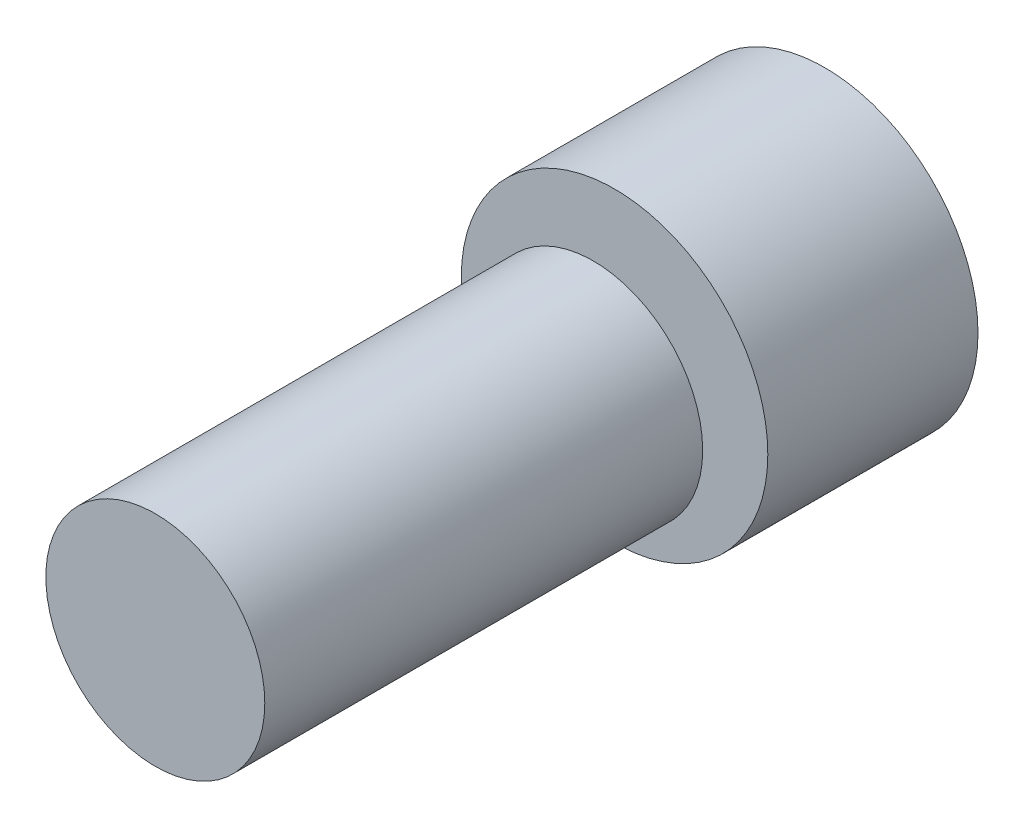
ISO-10303-21;
HEADER;
FILE_DESCRIPTION(('STEP AP214'),'2;1');
FILE_NAME('part.step','',(''),(''),'','','');
FILE_SCHEMA(('AUTOMOTIVE_DESIGN { 1 0 10303 214 1 1 1 1 }'));
ENDSEC;
DATA;
#1=APPLICATION_CONTEXT('core data for automotive mechanical design processes');
#2=APPLICATION_PROTOCOL_DEFINITION('international standard','automotive_design',2000,#1);
#3=PRODUCT_CONTEXT('',#1,'mechanical');
#4=PRODUCT('Part','Part','',(#3));
#5=PRODUCT_RELATED_PRODUCT_CATEGORY('part','',(#4));
#6=PRODUCT_DEFINITION_FORMATION('','',#4);
#7=PRODUCT_DEFINITION_CONTEXT('part definition',#1,'design');
#8=PRODUCT_DEFINITION('design','',#6,#7);
#9=PRODUCT_DEFINITION_SHAPE('','',#8);
#10=(LENGTH_UNIT() NAMED_UNIT(*) SI_UNIT(.MILLI.,.METRE.));
#11=(NAMED_UNIT(*) PLANE_ANGLE_UNIT() SI_UNIT($,.RADIAN.));
#12=(NAMED_UNIT(*) SI_UNIT($,.STERADIAN.) SOLID_ANGLE_UNIT());
#13=UNCERTAINTY_MEASURE_WITH_UNIT(LENGTH_MEASURE(1.E-05),#10,'distance_accuracy_value','');
#14=(GEOMETRIC_REPRESENTATION_CONTEXT(3) GLOBAL_UNCERTAINTY_ASSIGNED_CONTEXT((#13)) GLOBAL_UNIT_ASSIGNED_CONTEXT((#10,
#11,#12)) REPRESENTATION_CONTEXT('',''));
#15=CARTESIAN_POINT('',(0.,0.,0.));
#16=DIRECTION('',(0.,0.,1.));
#17=DIRECTION('',(1.,0.,0.));
#18=AXIS2_PLACEMENT_3D('',#15,#16,#17);
#19=CARTESIAN_POINT('',(2.06728971962617,2.82423674912851,4.8));
#20=DIRECTION('',(0.,0.,-1.));
#21=DIRECTION('',(-1.,0.,0.));
#22=AXIS2_PLACEMENT_3D('',#19,#20,#21);
#23=CYLINDRICAL_SURFACE('',#22,3.5);
#24=CARTESIAN_POINT('',(2.06728971962617,2.82423674912851,4.8));
#25=DIRECTION('',(0.,0.,1.));
#26=DIRECTION('',(1.,0.,0.));
#27=AXIS2_PLACEMENT_3D('',#24,#25,#26);
#28=CIRCLE('',#27,3.5);
#29=CARTESIAN_POINT('',(5.56728971962617,2.82423674912851,4.8));
#30=VERTEX_POINT('',#29);
#31=EDGE_CURVE('E10',#30,#30,#28,.T.);
#32=ORIENTED_EDGE('',*,*,#31,.F.);
#33=EDGE_LOOP('',(#32));
#34=FACE_BOUND('',#33,.T.);
#35=CARTESIAN_POINT('',(2.06728971962617,2.82423674912851,0.));
#36=DIRECTION('',(0.,0.,1.));
#37=DIRECTION('',(1.,0.,0.));
#38=AXIS2_PLACEMENT_3D('',#35,#36,#37);
#39=CIRCLE('',#38,3.5);
#40=CARTESIAN_POINT('',(5.56728971962617,2.82423674912851,0.));
#41=VERTEX_POINT('',#40);
#42=EDGE_CURVE('E41',#41,#41,#39,.T.);
#43=ORIENTED_EDGE('',*,*,#42,.T.);
#44=EDGE_LOOP('',(#43));
#45=FACE_BOUND('',#44,.T.);
#46=ADVANCED_FACE('F38',(#34,#45),#23,.T.);
#47=CARTESIAN_POINT('',(0.,0.,4.8));
#48=DIRECTION('',(0.,0.,1.));
#49=DIRECTION('',(1.,0.,0.));
#50=AXIS2_PLACEMENT_3D('',#47,#48,#49);
#51=PLANE('',#50);
#52=CARTESIAN_POINT('',(1.58,2.15852380111965,4.8));
#53=DIRECTION('',(0.,0.,1.));
#54=DIRECTION('',(1.,0.,0.));
#55=AXIS2_PLACEMENT_3D('',#52,#53,#54);
#56=CIRCLE('',#55,2.5);
#57=CARTESIAN_POINT('',(4.08,2.15852380111965,4.8));
#58=VERTEX_POINT('',#57);
#59=EDGE_CURVE('E48',#58,#58,#56,.F.);
#60=ORIENTED_EDGE('',*,*,#59,.T.);
#61=EDGE_LOOP('',(#60));
#62=FACE_BOUND('',#61,.T.);
#63=ORIENTED_EDGE('',*,*,#31,.T.);
#64=EDGE_LOOP('',(#63));
#65=FACE_BOUND('',#64,.T.);
#66=ADVANCED_FACE('F68',(#62,#65),#51,.T.);
#67=CARTESIAN_POINT('',(0.,0.,0.));
#68=DIRECTION('',(0.,0.,1.));
#69=DIRECTION('',(1.,0.,0.));
#70=AXIS2_PLACEMENT_3D('',#67,#68,#69);
#71=PLANE('',#70);
#72=ORIENTED_EDGE('',*,*,#42,.F.);
#73=EDGE_LOOP('',(#72));
#74=FACE_BOUND('',#73,.T.);
#75=ADVANCED_FACE('F60',(#74),#71,.F.);
#76=CARTESIAN_POINT('',(1.58,2.15852380111965,14.8));
#77=DIRECTION('',(0.,0.,-1.));
#78=DIRECTION('',(-1.,0.,0.));
#79=AXIS2_PLACEMENT_3D('',#76,#77,#78);
#80=CYLINDRICAL_SURFACE('',#79,2.5);
#81=ORIENTED_EDGE('',*,*,#59,.F.);
#82=EDGE_LOOP('',(#81));
#83=FACE_BOUND('',#82,.T.);
#84=CARTESIAN_POINT('',(1.58,2.15852380111965,14.8));
#85=DIRECTION('',(0.,0.,1.));
#86=DIRECTION('',(1.,0.,0.));
#87=AXIS2_PLACEMENT_3D('',#84,#85,#86);
#88=CIRCLE('',#87,2.5);
#89=CARTESIAN_POINT('',(4.08,2.15852380111965,14.8));
#90=VERTEX_POINT('',#89);
#91=EDGE_CURVE('E52',#90,#90,#88,.T.);
#92=ORIENTED_EDGE('',*,*,#91,.F.);
#93=EDGE_LOOP('',(#92));
#94=FACE_BOUND('',#93,.T.);
#95=ADVANCED_FACE('F58',(#83,#94),#80,.T.);
#96=CARTESIAN_POINT('',(1.58,2.15852380111965,14.8));
#97=DIRECTION('',(0.,0.,1.));
#98=DIRECTION('',(1.,0.,0.));
#99=AXIS2_PLACEMENT_3D('',#96,#97,#98);
#100=PLANE('',#99);
#101=ORIENTED_EDGE('',*,*,#91,.T.);
#102=EDGE_LOOP('',(#101));
#103=FACE_BOUND('',#102,.T.);
#104=ADVANCED_FACE('F56',(#103),#100,.T.);
#105=CLOSED_SHELL('',(#46,#66,#75,#95,#104));
#106=MANIFOLD_SOLID_BREP('B2',#105);
#107=ADVANCED_BREP_SHAPE_REPRESENTATION('',(#18,#106),#14);
#108=SHAPE_DEFINITION_REPRESENTATION(#9,#107);
ENDSEC;
END-ISO-10303-21;
